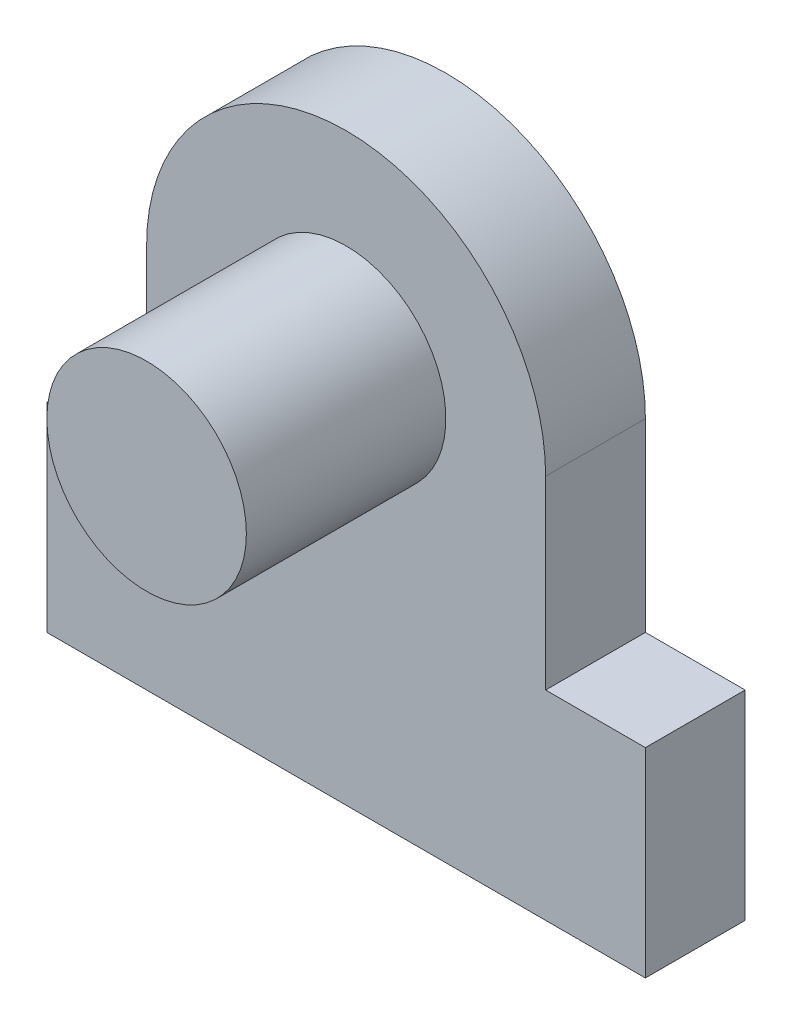
ISO-10303-21;
HEADER;
FILE_DESCRIPTION(('STEP AP214'),'2;1');
FILE_NAME('part.step','',(''),(''),'','','');
FILE_SCHEMA(('AUTOMOTIVE_DESIGN { 1 0 10303 214 1 1 1 1 }'));
ENDSEC;
DATA;
#1=APPLICATION_CONTEXT('core data for automotive mechanical design processes');
#2=APPLICATION_PROTOCOL_DEFINITION('international standard','automotive_design',2000,#1);
#3=PRODUCT_CONTEXT('',#1,'mechanical');
#4=PRODUCT('Part','Part','',(#3));
#5=PRODUCT_RELATED_PRODUCT_CATEGORY('part','',(#4));
#6=PRODUCT_DEFINITION_FORMATION('','',#4);
#7=PRODUCT_DEFINITION_CONTEXT('part definition',#1,'design');
#8=PRODUCT_DEFINITION('design','',#6,#7);
#9=PRODUCT_DEFINITION_SHAPE('','',#8);
#10=(LENGTH_UNIT() NAMED_UNIT(*) SI_UNIT(.MILLI.,.METRE.));
#11=(NAMED_UNIT(*) PLANE_ANGLE_UNIT() SI_UNIT($,.RADIAN.));
#12=(NAMED_UNIT(*) SI_UNIT($,.STERADIAN.) SOLID_ANGLE_UNIT());
#13=UNCERTAINTY_MEASURE_WITH_UNIT(LENGTH_MEASURE(1.E-05),#10,'distance_accuracy_value','');
#14=(GEOMETRIC_REPRESENTATION_CONTEXT(3) GLOBAL_UNCERTAINTY_ASSIGNED_CONTEXT((#13)) GLOBAL_UNIT_ASSIGNED_CONTEXT((#10,
#11,#12)) REPRESENTATION_CONTEXT('',''));
#15=CARTESIAN_POINT('',(0.,0.,0.));
#16=DIRECTION('',(0.,0.,1.));
#17=DIRECTION('',(1.,0.,0.));
#18=AXIS2_PLACEMENT_3D('',#15,#16,#17);
#19=CARTESIAN_POINT('',(0.,-20.,10.));
#20=DIRECTION('',(1.,0.,0.));
#21=DIRECTION('',(0.,1.,0.));
#22=AXIS2_PLACEMENT_3D('',#19,#20,#21);
#23=PLANE('',#22);
#24=DIRECTION('',(0.,-1.,0.));
#25=VECTOR('',#24,1.);
#26=CARTESIAN_POINT('',(0.,-20.,0.));
#27=LINE('',#26,#25);
#28=CARTESIAN_POINT('',(0.,0.,0.));
#29=VERTEX_POINT('',#28);
#30=CARTESIAN_POINT('',(0.,-20.,0.));
#31=VERTEX_POINT('',#30);
#32=EDGE_CURVE('E136',#29,#31,#27,.T.);
#33=ORIENTED_EDGE('',*,*,#32,.T.);
#34=DIRECTION('',(0.,0.,-1.));
#35=VECTOR('',#34,1.);
#36=CARTESIAN_POINT('',(0.,-20.,10.));
#37=LINE('',#36,#35);
#38=CARTESIAN_POINT('',(0.,-20.,10.));
#39=VERTEX_POINT('',#38);
#40=EDGE_CURVE('E47',#39,#31,#37,.T.);
#41=ORIENTED_EDGE('',*,*,#40,.F.);
#42=DIRECTION('',(0.,-1.,0.));
#43=VECTOR('',#42,1.);
#44=CARTESIAN_POINT('',(0.,-20.,10.));
#45=LINE('',#44,#43);
#46=CARTESIAN_POINT('',(0.,0.,10.));
#47=VERTEX_POINT('',#46);
#48=EDGE_CURVE('E151',#47,#39,#45,.T.);
#49=ORIENTED_EDGE('',*,*,#48,.F.);
#50=DIRECTION('',(0.,0.,-1.));
#51=VECTOR('',#50,1.);
#52=CARTESIAN_POINT('',(0.,0.,10.));
#53=LINE('',#52,#51);
#54=EDGE_CURVE('E132',#47,#29,#53,.T.);
#55=ORIENTED_EDGE('',*,*,#54,.T.);
#56=EDGE_LOOP('',(#33,#41,#49,#55));
#57=FACE_BOUND('',#56,.T.);
#58=ADVANCED_FACE('F39',(#57),#23,.F.);
#59=CARTESIAN_POINT('',(60.,-20.,10.));
#60=DIRECTION('',(0.,1.,0.));
#61=DIRECTION('',(-1.,0.,0.));
#62=AXIS2_PLACEMENT_3D('',#59,#60,#61);
#63=PLANE('',#62);
#64=DIRECTION('',(1.,0.,0.));
#65=VECTOR('',#64,1.);
#66=CARTESIAN_POINT('',(60.,-20.,0.));
#67=LINE('',#66,#65);
#68=CARTESIAN_POINT('',(60.,-20.,0.));
#69=VERTEX_POINT('',#68);
#70=EDGE_CURVE('E139',#31,#69,#67,.T.);
#71=ORIENTED_EDGE('',*,*,#70,.T.);
#72=DIRECTION('',(0.,0.,-1.));
#73=VECTOR('',#72,1.);
#74=CARTESIAN_POINT('',(60.,-20.,10.));
#75=LINE('',#74,#73);
#76=CARTESIAN_POINT('',(60.,-20.,10.));
#77=VERTEX_POINT('',#76);
#78=EDGE_CURVE('E161',#77,#69,#75,.T.);
#79=ORIENTED_EDGE('',*,*,#78,.F.);
#80=DIRECTION('',(1.,0.,0.));
#81=VECTOR('',#80,1.);
#82=CARTESIAN_POINT('',(60.,-20.,10.));
#83=LINE('',#82,#81);
#84=EDGE_CURVE('E99',#39,#77,#83,.T.);
#85=ORIENTED_EDGE('',*,*,#84,.F.);
#86=ORIENTED_EDGE('',*,*,#40,.T.);
#87=EDGE_LOOP('',(#71,#79,#85,#86));
#88=FACE_BOUND('',#87,.T.);
#89=ADVANCED_FACE('F164',(#88),#63,.F.);
#90=CARTESIAN_POINT('',(60.,0.,10.));
#91=DIRECTION('',(-1.,0.,0.));
#92=DIRECTION('',(0.,0.,1.));
#93=AXIS2_PLACEMENT_3D('',#90,#91,#92);
#94=PLANE('',#93);
#95=DIRECTION('',(0.,1.,0.));
#96=VECTOR('',#95,1.);
#97=CARTESIAN_POINT('',(60.,0.,0.));
#98=LINE('',#97,#96);
#99=CARTESIAN_POINT('',(60.,0.,0.));
#100=VERTEX_POINT('',#99);
#101=EDGE_CURVE('E142',#69,#100,#98,.T.);
#102=ORIENTED_EDGE('',*,*,#101,.T.);
#103=DIRECTION('',(0.,0.,-1.));
#104=VECTOR('',#103,1.);
#105=CARTESIAN_POINT('',(60.,0.,10.));
#106=LINE('',#105,#104);
#107=CARTESIAN_POINT('',(60.,0.,10.));
#108=VERTEX_POINT('',#107);
#109=EDGE_CURVE('E158',#108,#100,#106,.T.);
#110=ORIENTED_EDGE('',*,*,#109,.F.);
#111=DIRECTION('',(0.,1.,0.));
#112=VECTOR('',#111,1.);
#113=CARTESIAN_POINT('',(60.,0.,10.));
#114=LINE('',#113,#112);
#115=EDGE_CURVE('E182',#77,#108,#114,.T.);
#116=ORIENTED_EDGE('',*,*,#115,.F.);
#117=ORIENTED_EDGE('',*,*,#78,.T.);
#118=EDGE_LOOP('',(#102,#110,#116,#117));
#119=FACE_BOUND('',#118,.T.);
#120=ADVANCED_FACE('F175',(#119),#94,.F.);
#121=CARTESIAN_POINT('',(50.,0.,10.));
#122=DIRECTION('',(0.,-1.,0.));
#123=DIRECTION('',(0.,0.,-1.));
#124=AXIS2_PLACEMENT_3D('',#121,#122,#123);
#125=PLANE('',#124);
#126=DIRECTION('',(-1.,0.,0.));
#127=VECTOR('',#126,1.);
#128=CARTESIAN_POINT('',(50.,0.,0.));
#129=LINE('',#128,#127);
#130=CARTESIAN_POINT('',(50.,0.,0.));
#131=VERTEX_POINT('',#130);
#132=EDGE_CURVE('E144',#100,#131,#129,.T.);
#133=ORIENTED_EDGE('',*,*,#132,.T.);
#134=DIRECTION('',(0.,0.,-1.));
#135=VECTOR('',#134,1.);
#136=CARTESIAN_POINT('',(50.,0.,10.));
#137=LINE('',#136,#135);
#138=CARTESIAN_POINT('',(50.,0.,10.));
#139=VERTEX_POINT('',#138);
#140=EDGE_CURVE('E155',#139,#131,#137,.T.);
#141=ORIENTED_EDGE('',*,*,#140,.F.);
#142=DIRECTION('',(-1.,0.,0.));
#143=VECTOR('',#142,1.);
#144=CARTESIAN_POINT('',(50.,0.,10.));
#145=LINE('',#144,#143);
#146=EDGE_CURVE('E181',#108,#139,#145,.T.);
#147=ORIENTED_EDGE('',*,*,#146,.F.);
#148=ORIENTED_EDGE('',*,*,#109,.T.);
#149=EDGE_LOOP('',(#133,#141,#147,#148));
#150=FACE_BOUND('',#149,.T.);
#151=ADVANCED_FACE('F179',(#150),#125,.F.);
#152=CARTESIAN_POINT('',(50.,18.56,10.));
#153=DIRECTION('',(-1.,0.,0.));
#154=DIRECTION('',(0.,0.,1.));
#155=AXIS2_PLACEMENT_3D('',#152,#153,#154);
#156=PLANE('',#155);
#157=DIRECTION('',(0.,1.,0.));
#158=VECTOR('',#157,1.);
#159=CARTESIAN_POINT('',(50.,18.56,0.));
#160=LINE('',#159,#158);
#161=CARTESIAN_POINT('',(50.,18.56,0.));
#162=VERTEX_POINT('',#161);
#163=EDGE_CURVE('E146',#131,#162,#160,.T.);
#164=ORIENTED_EDGE('',*,*,#163,.T.);
#165=DIRECTION('',(0.,0.,-1.));
#166=VECTOR('',#165,1.);
#167=CARTESIAN_POINT('',(50.,18.56,10.));
#168=LINE('',#167,#166);
#169=CARTESIAN_POINT('',(50.,18.56,10.));
#170=VERTEX_POINT('',#169);
#171=EDGE_CURVE('E127',#170,#162,#168,.T.);
#172=ORIENTED_EDGE('',*,*,#171,.F.);
#173=DIRECTION('',(0.,1.,0.));
#174=VECTOR('',#173,1.);
#175=CARTESIAN_POINT('',(50.,18.56,10.));
#176=LINE('',#175,#174);
#177=EDGE_CURVE('E118',#139,#170,#176,.T.);
#178=ORIENTED_EDGE('',*,*,#177,.F.);
#179=ORIENTED_EDGE('',*,*,#140,.T.);
#180=EDGE_LOOP('',(#164,#172,#178,#179));
#181=FACE_BOUND('',#180,.T.);
#182=ADVANCED_FACE('F219',(#181),#156,.F.);
#183=CARTESIAN_POINT('',(30.,18.56,10.));
#184=DIRECTION('',(0.,0.,-1.));
#185=DIRECTION('',(-1.,0.,0.));
#186=AXIS2_PLACEMENT_3D('',#183,#184,#185);
#187=CYLINDRICAL_SURFACE('',#186,20.);
#188=CARTESIAN_POINT('',(30.,18.56,0.));
#189=DIRECTION('',(0.,0.,1.));
#190=DIRECTION('',(-1.,0.,0.));
#191=AXIS2_PLACEMENT_3D('',#188,#189,#190);
#192=CIRCLE('',#191,20.);
#193=CARTESIAN_POINT('',(10.,18.56,0.));
#194=VERTEX_POINT('',#193);
#195=EDGE_CURVE('E126',#162,#194,#192,.T.);
#196=ORIENTED_EDGE('',*,*,#195,.T.);
#197=DIRECTION('',(0.,0.,-1.));
#198=VECTOR('',#197,1.);
#199=CARTESIAN_POINT('',(10.,18.56,10.));
#200=LINE('',#199,#198);
#201=CARTESIAN_POINT('',(10.,18.56,10.));
#202=VERTEX_POINT('',#201);
#203=EDGE_CURVE('E123',#202,#194,#200,.T.);
#204=ORIENTED_EDGE('',*,*,#203,.F.);
#205=CARTESIAN_POINT('',(30.,18.56,10.));
#206=DIRECTION('',(0.,0.,1.));
#207=DIRECTION('',(-1.,0.,0.));
#208=AXIS2_PLACEMENT_3D('',#205,#206,#207);
#209=CIRCLE('',#208,20.);
#210=EDGE_CURVE('E112',#170,#202,#209,.T.);
#211=ORIENTED_EDGE('',*,*,#210,.F.);
#212=ORIENTED_EDGE('',*,*,#171,.T.);
#213=EDGE_LOOP('',(#196,#204,#211,#212));
#214=FACE_BOUND('',#213,.T.);
#215=ADVANCED_FACE('F124',(#214),#187,.T.);
#216=CARTESIAN_POINT('',(10.,0.,10.));
#217=DIRECTION('',(1.,0.,0.));
#218=DIRECTION('',(0.,0.,-1.));
#219=AXIS2_PLACEMENT_3D('',#216,#217,#218);
#220=PLANE('',#219);
#221=DIRECTION('',(0.,-1.,0.));
#222=VECTOR('',#221,1.);
#223=CARTESIAN_POINT('',(10.,0.,0.));
#224=LINE('',#223,#222);
#225=CARTESIAN_POINT('',(10.,0.,0.));
#226=VERTEX_POINT('',#225);
#227=EDGE_CURVE('E84',#194,#226,#224,.T.);
#228=ORIENTED_EDGE('',*,*,#227,.T.);
#229=DIRECTION('',(0.,0.,-1.));
#230=VECTOR('',#229,1.);
#231=CARTESIAN_POINT('',(10.,0.,10.));
#232=LINE('',#231,#230);
#233=CARTESIAN_POINT('',(10.,0.,10.));
#234=VERTEX_POINT('',#233);
#235=EDGE_CURVE('E128',#234,#226,#232,.T.);
#236=ORIENTED_EDGE('',*,*,#235,.F.);
#237=DIRECTION('',(0.,-1.,0.));
#238=VECTOR('',#237,1.);
#239=CARTESIAN_POINT('',(10.,0.,10.));
#240=LINE('',#239,#238);
#241=EDGE_CURVE('E116',#202,#234,#240,.T.);
#242=ORIENTED_EDGE('',*,*,#241,.F.);
#243=ORIENTED_EDGE('',*,*,#203,.T.);
#244=EDGE_LOOP('',(#228,#236,#242,#243));
#245=FACE_BOUND('',#244,.T.);
#246=ADVANCED_FACE('F130',(#245),#220,.F.);
#247=CARTESIAN_POINT('',(0.,0.,10.));
#248=DIRECTION('',(0.,-1.,0.));
#249=DIRECTION('',(0.,0.,-1.));
#250=AXIS2_PLACEMENT_3D('',#247,#248,#249);
#251=PLANE('',#250);
#252=DIRECTION('',(-1.,0.,0.));
#253=VECTOR('',#252,1.);
#254=CARTESIAN_POINT('',(0.,0.,0.));
#255=LINE('',#254,#253);
#256=EDGE_CURVE('E90',#226,#29,#255,.T.);
#257=ORIENTED_EDGE('',*,*,#256,.T.);
#258=ORIENTED_EDGE('',*,*,#54,.F.);
#259=DIRECTION('',(-1.,0.,0.));
#260=VECTOR('',#259,1.);
#261=CARTESIAN_POINT('',(0.,0.,10.));
#262=LINE('',#261,#260);
#263=EDGE_CURVE('E55',#234,#47,#262,.T.);
#264=ORIENTED_EDGE('',*,*,#263,.F.);
#265=ORIENTED_EDGE('',*,*,#235,.T.);
#266=EDGE_LOOP('',(#257,#258,#264,#265));
#267=FACE_BOUND('',#266,.T.);
#268=ADVANCED_FACE('F200',(#267),#251,.F.);
#269=CARTESIAN_POINT('',(30.,18.56,10.));
#270=DIRECTION('',(0.,0.,-1.));
#271=DIRECTION('',(-1.,0.,0.));
#272=AXIS2_PLACEMENT_3D('',#269,#270,#271);
#273=PLANE('',#272);
#274=CARTESIAN_POINT('',(30.,18.56,10.));
#275=DIRECTION('',(0.,0.,-1.));
#276=DIRECTION('',(-1.,0.,0.));
#277=AXIS2_PLACEMENT_3D('',#274,#275,#276);
#278=CIRCLE('',#277,10.);
#279=CARTESIAN_POINT('',(20.,18.56,10.));
#280=VERTEX_POINT('',#279);
#281=EDGE_CURVE('E11',#280,#280,#278,.F.);
#282=ORIENTED_EDGE('',*,*,#281,.F.);
#283=EDGE_LOOP('',(#282));
#284=FACE_BOUND('',#283,.T.);
#285=ORIENTED_EDGE('',*,*,#48,.T.);
#286=ORIENTED_EDGE('',*,*,#84,.T.);
#287=ORIENTED_EDGE('',*,*,#115,.T.);
#288=ORIENTED_EDGE('',*,*,#146,.T.);
#289=ORIENTED_EDGE('',*,*,#177,.T.);
#290=ORIENTED_EDGE('',*,*,#210,.T.);
#291=ORIENTED_EDGE('',*,*,#241,.T.);
#292=ORIENTED_EDGE('',*,*,#263,.T.);
#293=EDGE_LOOP('',(#285,#286,#287,#288,#289,#290,#291,#292));
#294=FACE_BOUND('',#293,.T.);
#295=ADVANCED_FACE('F114',(#284,#294),#273,.F.);
#296=CARTESIAN_POINT('',(30.,18.56,0.));
#297=DIRECTION('',(0.,0.,-1.));
#298=DIRECTION('',(-1.,0.,0.));
#299=AXIS2_PLACEMENT_3D('',#296,#297,#298);
#300=PLANE('',#299);
#301=ORIENTED_EDGE('',*,*,#32,.F.);
#302=ORIENTED_EDGE('',*,*,#256,.F.);
#303=ORIENTED_EDGE('',*,*,#227,.F.);
#304=ORIENTED_EDGE('',*,*,#195,.F.);
#305=ORIENTED_EDGE('',*,*,#163,.F.);
#306=ORIENTED_EDGE('',*,*,#132,.F.);
#307=ORIENTED_EDGE('',*,*,#101,.F.);
#308=ORIENTED_EDGE('',*,*,#70,.F.);
#309=EDGE_LOOP('',(#301,#302,#303,#304,#305,#306,#307,#308));
#310=FACE_BOUND('',#309,.T.);
#311=ADVANCED_FACE('F169',(#310),#300,.T.);
#312=CARTESIAN_POINT('',(30.,18.56,30.));
#313=DIRECTION('',(0.,0.,-1.));
#314=DIRECTION('',(-1.,0.,0.));
#315=AXIS2_PLACEMENT_3D('',#312,#313,#314);
#316=CYLINDRICAL_SURFACE('',#315,10.);
#317=CARTESIAN_POINT('',(30.,18.56,30.));
#318=DIRECTION('',(0.,0.,1.));
#319=DIRECTION('',(1.,0.,0.));
#320=AXIS2_PLACEMENT_3D('',#317,#318,#319);
#321=CIRCLE('',#320,10.);
#322=CARTESIAN_POINT('',(40.,18.56,30.));
#323=VERTEX_POINT('',#322);
#324=EDGE_CURVE('E140',#323,#323,#321,.T.);
#325=ORIENTED_EDGE('',*,*,#324,.F.);
#326=EDGE_LOOP('',(#325));
#327=FACE_BOUND('',#326,.T.);
#328=ORIENTED_EDGE('',*,*,#281,.T.);
#329=EDGE_LOOP('',(#328));
#330=FACE_BOUND('',#329,.T.);
#331=ADVANCED_FACE('F193',(#327,#330),#316,.T.);
#332=CARTESIAN_POINT('',(30.,18.56,30.));
#333=DIRECTION('',(0.,0.,1.));
#334=DIRECTION('',(1.,0.,0.));
#335=AXIS2_PLACEMENT_3D('',#332,#333,#334);
#336=PLANE('',#335);
#337=ORIENTED_EDGE('',*,*,#324,.T.);
#338=EDGE_LOOP('',(#337));
#339=FACE_BOUND('',#338,.T.);
#340=ADVANCED_FACE('F191',(#339),#336,.T.);
#341=CLOSED_SHELL('',(#58,#89,#120,#151,#182,#215,#246,#268,#295,#311,#331,#340));
#342=MANIFOLD_SOLID_BREP('B2',#341);
#343=ADVANCED_BREP_SHAPE_REPRESENTATION('',(#18,#342),#14);
#344=SHAPE_DEFINITION_REPRESENTATION(#9,#343);
ENDSEC;
END-ISO-10303-21;
